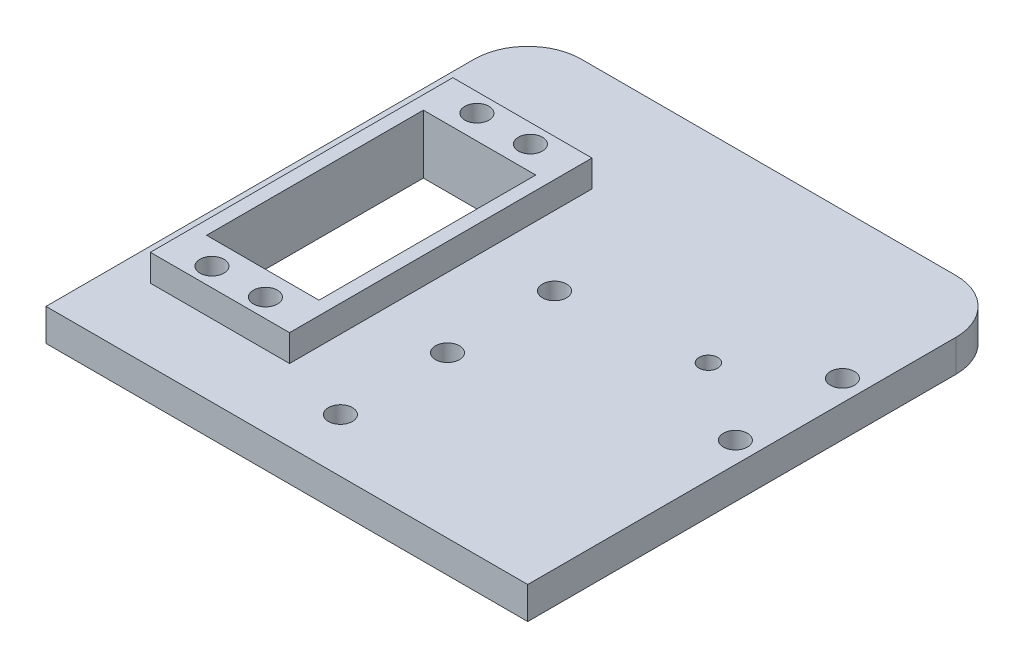
ISO-10303-21;
HEADER;
FILE_DESCRIPTION(('STEP AP214'),'2;1');
FILE_NAME('part.step','',(''),(''),'','','');
FILE_SCHEMA(('AUTOMOTIVE_DESIGN { 1 0 10303 214 1 1 1 1 }'));
ENDSEC;
DATA;
#1=APPLICATION_CONTEXT('core data for automotive mechanical design processes');
#2=APPLICATION_PROTOCOL_DEFINITION('international standard','automotive_design',2000,#1);
#3=PRODUCT_CONTEXT('',#1,'mechanical');
#4=PRODUCT('Part','Part','',(#3));
#5=PRODUCT_RELATED_PRODUCT_CATEGORY('part','',(#4));
#6=PRODUCT_DEFINITION_FORMATION('','',#4);
#7=PRODUCT_DEFINITION_CONTEXT('part definition',#1,'design');
#8=PRODUCT_DEFINITION('design','',#6,#7);
#9=PRODUCT_DEFINITION_SHAPE('','',#8);
#10=(LENGTH_UNIT() NAMED_UNIT(*) SI_UNIT(.MILLI.,.METRE.));
#11=(NAMED_UNIT(*) PLANE_ANGLE_UNIT() SI_UNIT($,.RADIAN.));
#12=(NAMED_UNIT(*) SI_UNIT($,.STERADIAN.) SOLID_ANGLE_UNIT());
#13=UNCERTAINTY_MEASURE_WITH_UNIT(LENGTH_MEASURE(1.E-05),#10,'distance_accuracy_value','');
#14=(GEOMETRIC_REPRESENTATION_CONTEXT(3) GLOBAL_UNCERTAINTY_ASSIGNED_CONTEXT((#13)) GLOBAL_UNIT_ASSIGNED_CONTEXT((#10,
#11,#12)) REPRESENTATION_CONTEXT('',''));
#15=CARTESIAN_POINT('',(0.,0.,0.));
#16=DIRECTION('',(0.,0.,1.));
#17=DIRECTION('',(1.,0.,0.));
#18=AXIS2_PLACEMENT_3D('',#15,#16,#17);
#19=CARTESIAN_POINT('',(0.,0.,0.));
#20=DIRECTION('',(0.,1.,0.));
#21=DIRECTION('',(0.,0.,1.));
#22=AXIS2_PLACEMENT_3D('',#19,#20,#21);
#23=PLANE('',#22);
#24=CARTESIAN_POINT('',(26.,0.,-2.75));
#25=DIRECTION('',(0.,1.,0.));
#26=DIRECTION('',(0.,0.,1.));
#27=AXIS2_PLACEMENT_3D('',#24,#25,#26);
#28=CIRCLE('',#27,1.75);
#29=CARTESIAN_POINT('',(26.,0.,-0.999999999999999));
#30=VERTEX_POINT('',#29);
#31=EDGE_CURVE('E279',#30,#30,#28,.T.);
#32=ORIENTED_EDGE('',*,*,#31,.T.);
#33=EDGE_LOOP('',(#32));
#34=FACE_BOUND('',#33,.T.);
#35=CARTESIAN_POINT('',(26.,0.,-2.75));
#36=DIRECTION('',(0.,-1.,0.));
#37=DIRECTION('',(0.,0.,-1.));
#38=AXIS2_PLACEMENT_3D('',#35,#36,#37);
#39=CIRCLE('',#38,7.5);
#40=CARTESIAN_POINT('',(26.,0.,-10.25));
#41=VERTEX_POINT('',#40);
#42=EDGE_CURVE('E320',#41,#41,#39,.T.);
#43=ORIENTED_EDGE('',*,*,#42,.T.);
#44=EDGE_LOOP('',(#43));
#45=FACE_BOUND('',#44,.T.);
#46=ADVANCED_FACE('F44',(#34,#45),#23,.F.);
#47=CARTESIAN_POINT('',(0.,6.,0.));
#48=DIRECTION('',(0.,1.,0.));
#49=DIRECTION('',(0.,0.,1.));
#50=AXIS2_PLACEMENT_3D('',#47,#48,#49);
#51=PLANE('',#50);
#52=CARTESIAN_POINT('',(0.,6.,0.));
#53=DIRECTION('',(0.,1.,0.));
#54=DIRECTION('',(0.,0.,1.));
#55=AXIS2_PLACEMENT_3D('',#52,#53,#54);
#56=CIRCLE('',#55,2.25);
#57=CARTESIAN_POINT('',(0.,6.,2.25));
#58=VERTEX_POINT('',#57);
#59=EDGE_CURVE('E313',#58,#58,#56,.T.);
#60=ORIENTED_EDGE('',*,*,#59,.F.);
#61=EDGE_LOOP('',(#60));
#62=FACE_BOUND('',#61,.T.);
#63=CARTESIAN_POINT('',(0.,6.,20.));
#64=DIRECTION('',(0.,1.,0.));
#65=DIRECTION('',(0.,0.,1.));
#66=AXIS2_PLACEMENT_3D('',#63,#64,#65);
#67=CIRCLE('',#66,2.25);
#68=CARTESIAN_POINT('',(0.,6.,22.25));
#69=VERTEX_POINT('',#68);
#70=EDGE_CURVE('E773',#69,#69,#67,.T.);
#71=ORIENTED_EDGE('',*,*,#70,.F.);
#72=EDGE_LOOP('',(#71));
#73=FACE_BOUND('',#72,.T.);
#74=CARTESIAN_POINT('',(0.,6.,40.));
#75=DIRECTION('',(0.,1.,0.));
#76=DIRECTION('',(0.,0.,1.));
#77=AXIS2_PLACEMENT_3D('',#74,#75,#76);
#78=CIRCLE('',#77,2.25);
#79=CARTESIAN_POINT('',(0.,6.,42.25));
#80=VERTEX_POINT('',#79);
#81=EDGE_CURVE('E777',#80,#80,#78,.T.);
#82=ORIENTED_EDGE('',*,*,#81,.F.);
#83=EDGE_LOOP('',(#82));
#84=FACE_BOUND('',#83,.T.);
#85=CARTESIAN_POINT('',(-41.6973967527109,6.,-12.75));
#86=DIRECTION('',(0.,1.,0.));
#87=DIRECTION('',(0.,0.,1.));
#88=AXIS2_PLACEMENT_3D('',#85,#86,#87);
#89=CIRCLE('',#88,2.25);
#90=CARTESIAN_POINT('',(-41.6973967527109,6.,-10.5));
#91=VERTEX_POINT('',#90);
#92=EDGE_CURVE('E366',#91,#91,#89,.T.);
#93=ORIENTED_EDGE('',*,*,#92,.F.);
#94=EDGE_LOOP('',(#93));
#95=FACE_BOUND('',#94,.T.);
#96=CARTESIAN_POINT('',(41.0420349176978,6.,7.25));
#97=DIRECTION('',(0.,1.,0.));
#98=DIRECTION('',(0.,0.,1.));
#99=AXIS2_PLACEMENT_3D('',#96,#97,#98);
#100=CIRCLE('',#99,2.25);
#101=CARTESIAN_POINT('',(41.0420349176978,6.,9.5));
#102=VERTEX_POINT('',#101);
#103=EDGE_CURVE('E362',#102,#102,#100,.T.);
#104=ORIENTED_EDGE('',*,*,#103,.F.);
#105=EDGE_LOOP('',(#104));
#106=FACE_BOUND('',#105,.T.);
#107=CARTESIAN_POINT('',(-41.6973967527109,6.,7.25));
#108=DIRECTION('',(0.,1.,0.));
#109=DIRECTION('',(0.,0.,1.));
#110=AXIS2_PLACEMENT_3D('',#107,#108,#109);
#111=CIRCLE('',#110,2.25);
#112=CARTESIAN_POINT('',(-41.6973967527109,6.,9.5));
#113=VERTEX_POINT('',#112);
#114=EDGE_CURVE('E358',#113,#113,#111,.T.);
#115=ORIENTED_EDGE('',*,*,#114,.F.);
#116=EDGE_LOOP('',(#115));
#117=FACE_BOUND('',#116,.T.);
#118=CARTESIAN_POINT('',(41.0420349176978,6.,-12.75));
#119=DIRECTION('',(0.,1.,0.));
#120=DIRECTION('',(0.,0.,1.));
#121=AXIS2_PLACEMENT_3D('',#118,#119,#120);
#122=CIRCLE('',#121,2.25);
#123=CARTESIAN_POINT('',(41.0420349176978,6.,-10.5));
#124=VERTEX_POINT('',#123);
#125=EDGE_CURVE('E354',#124,#124,#122,.T.);
#126=ORIENTED_EDGE('',*,*,#125,.F.);
#127=EDGE_LOOP('',(#126));
#128=FACE_BOUND('',#127,.T.);
#129=CARTESIAN_POINT('',(26.,6.,-2.75));
#130=DIRECTION('',(0.,1.,0.));
#131=DIRECTION('',(0.,0.,1.));
#132=AXIS2_PLACEMENT_3D('',#129,#130,#131);
#133=CIRCLE('',#132,1.75);
#134=CARTESIAN_POINT('',(26.,6.,-0.999999999999999));
#135=VERTEX_POINT('',#134);
#136=EDGE_CURVE('E284',#135,#135,#133,.T.);
#137=ORIENTED_EDGE('',*,*,#136,.F.);
#138=EDGE_LOOP('',(#137));
#139=FACE_BOUND('',#138,.T.);
#140=DIRECTION('',(0.,0.,-1.));
#141=VECTOR('',#140,1.);
#142=CARTESIAN_POINT('',(45.,6.,-40.));
#143=LINE('',#142,#141);
#144=CARTESIAN_POINT('',(45.,6.,50.));
#145=VERTEX_POINT('',#144);
#146=CARTESIAN_POINT('',(45.,6.,-30.));
#147=VERTEX_POINT('',#146);
#148=EDGE_CURVE('E254',#145,#147,#143,.T.);
#149=ORIENTED_EDGE('',*,*,#148,.T.);
#150=CARTESIAN_POINT('',(35.,6.,-30.));
#151=DIRECTION('',(0.,1.,0.));
#152=DIRECTION('',(0.,0.,1.));
#153=AXIS2_PLACEMENT_3D('',#150,#151,#152);
#154=CIRCLE('',#153,10.);
#155=CARTESIAN_POINT('',(35.,6.,-40.));
#156=VERTEX_POINT('',#155);
#157=EDGE_CURVE('E54',#147,#156,#154,.T.);
#158=ORIENTED_EDGE('',*,*,#157,.T.);
#159=DIRECTION('',(-1.,0.,0.));
#160=VECTOR('',#159,1.);
#161=CARTESIAN_POINT('',(-45.,6.,-40.));
#162=LINE('',#161,#160);
#163=CARTESIAN_POINT('',(-35.,6.,-40.));
#164=VERTEX_POINT('',#163);
#165=EDGE_CURVE('E257',#156,#164,#162,.T.);
#166=ORIENTED_EDGE('',*,*,#165,.T.);
#167=CARTESIAN_POINT('',(-35.,6.,-30.));
#168=DIRECTION('',(0.,1.,0.));
#169=DIRECTION('',(0.,0.,1.));
#170=AXIS2_PLACEMENT_3D('',#167,#168,#169);
#171=CIRCLE('',#170,10.);
#172=CARTESIAN_POINT('',(-45.,6.,-30.));
#173=VERTEX_POINT('',#172);
#174=EDGE_CURVE('E296',#164,#173,#171,.T.);
#175=ORIENTED_EDGE('',*,*,#174,.T.);
#176=DIRECTION('',(0.,0.,1.));
#177=VECTOR('',#176,1.);
#178=CARTESIAN_POINT('',(-45.,6.,-40.));
#179=LINE('',#178,#177);
#180=CARTESIAN_POINT('',(-45.,6.,50.));
#181=VERTEX_POINT('',#180);
#182=EDGE_CURVE('E247',#173,#181,#179,.T.);
#183=ORIENTED_EDGE('',*,*,#182,.T.);
#184=DIRECTION('',(1.,0.,0.));
#185=VECTOR('',#184,1.);
#186=CARTESIAN_POINT('',(-45.,6.,50.));
#187=LINE('',#186,#185);
#188=EDGE_CURVE('E250',#181,#145,#187,.T.);
#189=ORIENTED_EDGE('',*,*,#188,.T.);
#190=EDGE_LOOP('',(#149,#158,#166,#175,#183,#189));
#191=FACE_BOUND('',#190,.T.);
#192=DIRECTION('',(1.,0.,0.));
#193=VECTOR('',#192,1.);
#194=CARTESIAN_POINT('',(-39.,6.,36.5));
#195=LINE('',#194,#193);
#196=CARTESIAN_POINT('',(-39.,6.,36.5));
#197=VERTEX_POINT('',#196);
#198=CARTESIAN_POINT('',(-13.,6.,36.5));
#199=VERTEX_POINT('',#198);
#200=EDGE_CURVE('E224',#197,#199,#195,.T.);
#201=ORIENTED_EDGE('',*,*,#200,.F.);
#202=DIRECTION('',(0.,0.,1.));
#203=VECTOR('',#202,1.);
#204=CARTESIAN_POINT('',(-39.,6.,-20.));
#205=LINE('',#204,#203);
#206=CARTESIAN_POINT('',(-39.,6.,-20.));
#207=VERTEX_POINT('',#206);
#208=EDGE_CURVE('E205',#207,#197,#205,.T.);
#209=ORIENTED_EDGE('',*,*,#208,.F.);
#210=DIRECTION('',(-1.,0.,0.));
#211=VECTOR('',#210,1.);
#212=CARTESIAN_POINT('',(-39.,6.,-20.));
#213=LINE('',#212,#211);
#214=CARTESIAN_POINT('',(-13.,6.,-20.));
#215=VERTEX_POINT('',#214);
#216=EDGE_CURVE('E211',#215,#207,#213,.T.);
#217=ORIENTED_EDGE('',*,*,#216,.F.);
#218=DIRECTION('',(0.,0.,-1.));
#219=VECTOR('',#218,1.);
#220=CARTESIAN_POINT('',(-13.,6.,-20.));
#221=LINE('',#220,#219);
#222=EDGE_CURVE('E227',#199,#215,#221,.T.);
#223=ORIENTED_EDGE('',*,*,#222,.F.);
#224=EDGE_LOOP('',(#201,#209,#217,#223));
#225=FACE_BOUND('',#224,.T.);
#226=ADVANCED_FACE('F424',(#62,#73,#84,#95,#106,#117,#128,#139,#191,#225),#51,.T.);
#227=CARTESIAN_POINT('',(-45.,6.,-40.));
#228=DIRECTION('',(1.,0.,0.));
#229=DIRECTION('',(0.,0.,-1.));
#230=AXIS2_PLACEMENT_3D('',#227,#228,#229);
#231=PLANE('',#230);
#232=ORIENTED_EDGE('',*,*,#182,.F.);
#233=DIRECTION('',(0.,-1.,0.));
#234=VECTOR('',#233,1.);
#235=CARTESIAN_POINT('',(-45.,6.,-30.));
#236=LINE('',#235,#234);
#237=CARTESIAN_POINT('',(-45.,0.,-30.));
#238=VERTEX_POINT('',#237);
#239=EDGE_CURVE('E278',#173,#238,#236,.T.);
#240=ORIENTED_EDGE('',*,*,#239,.T.);
#241=DIRECTION('',(0.,0.,1.));
#242=VECTOR('',#241,1.);
#243=CARTESIAN_POINT('',(-45.,0.,-40.));
#244=LINE('',#243,#242);
#245=CARTESIAN_POINT('',(-45.,0.,50.));
#246=VERTEX_POINT('',#245);
#247=EDGE_CURVE('E246',#238,#246,#244,.T.);
#248=ORIENTED_EDGE('',*,*,#247,.T.);
#249=DIRECTION('',(0.,-1.,0.));
#250=VECTOR('',#249,1.);
#251=CARTESIAN_POINT('',(-45.,6.,50.));
#252=LINE('',#251,#250);
#253=EDGE_CURVE('E274',#181,#246,#252,.T.);
#254=ORIENTED_EDGE('',*,*,#253,.F.);
#255=EDGE_LOOP('',(#232,#240,#248,#254));
#256=FACE_BOUND('',#255,.T.);
#257=ADVANCED_FACE('F435',(#256),#231,.F.);
#258=CARTESIAN_POINT('',(-45.,6.,50.));
#259=DIRECTION('',(0.,0.,-1.));
#260=DIRECTION('',(-1.,0.,0.));
#261=AXIS2_PLACEMENT_3D('',#258,#259,#260);
#262=PLANE('',#261);
#263=DIRECTION('',(1.,0.,0.));
#264=VECTOR('',#263,1.);
#265=CARTESIAN_POINT('',(-45.,0.,50.));
#266=LINE('',#265,#264);
#267=CARTESIAN_POINT('',(45.,0.,50.));
#268=VERTEX_POINT('',#267);
#269=EDGE_CURVE('E263',#246,#268,#266,.T.);
#270=ORIENTED_EDGE('',*,*,#269,.T.);
#271=DIRECTION('',(0.,-1.,0.));
#272=VECTOR('',#271,1.);
#273=CARTESIAN_POINT('',(45.,6.,50.));
#274=LINE('',#273,#272);
#275=EDGE_CURVE('E260',#145,#268,#274,.T.);
#276=ORIENTED_EDGE('',*,*,#275,.F.);
#277=ORIENTED_EDGE('',*,*,#188,.F.);
#278=ORIENTED_EDGE('',*,*,#253,.T.);
#279=EDGE_LOOP('',(#270,#276,#277,#278));
#280=FACE_BOUND('',#279,.T.);
#281=ADVANCED_FACE('F432',(#280),#262,.F.);
#282=CARTESIAN_POINT('',(45.,6.,-40.));
#283=DIRECTION('',(-1.,0.,0.));
#284=DIRECTION('',(0.,0.,1.));
#285=AXIS2_PLACEMENT_3D('',#282,#283,#284);
#286=PLANE('',#285);
#287=DIRECTION('',(0.,0.,-1.));
#288=VECTOR('',#287,1.);
#289=CARTESIAN_POINT('',(45.,0.,-40.));
#290=LINE('',#289,#288);
#291=CARTESIAN_POINT('',(45.,0.,-30.));
#292=VERTEX_POINT('',#291);
#293=EDGE_CURVE('E266',#268,#292,#290,.T.);
#294=ORIENTED_EDGE('',*,*,#293,.T.);
#295=DIRECTION('',(0.,-1.,0.));
#296=VECTOR('',#295,1.);
#297=CARTESIAN_POINT('',(45.,6.,-30.));
#298=LINE('',#297,#296);
#299=EDGE_CURVE('E62',#292,#147,#298,.F.);
#300=ORIENTED_EDGE('',*,*,#299,.T.);
#301=ORIENTED_EDGE('',*,*,#148,.F.);
#302=ORIENTED_EDGE('',*,*,#275,.T.);
#303=EDGE_LOOP('',(#294,#300,#301,#302));
#304=FACE_BOUND('',#303,.T.);
#305=ADVANCED_FACE('F428',(#304),#286,.F.);
#306=CARTESIAN_POINT('',(-45.,6.,-40.));
#307=DIRECTION('',(0.,0.,1.));
#308=DIRECTION('',(1.,0.,0.));
#309=AXIS2_PLACEMENT_3D('',#306,#307,#308);
#310=PLANE('',#309);
#311=ORIENTED_EDGE('',*,*,#165,.F.);
#312=DIRECTION('',(0.,-1.,0.));
#313=VECTOR('',#312,1.);
#314=CARTESIAN_POINT('',(35.,6.,-40.));
#315=LINE('',#314,#313);
#316=CARTESIAN_POINT('',(35.,0.,-40.));
#317=VERTEX_POINT('',#316);
#318=EDGE_CURVE('E299',#156,#317,#315,.T.);
#319=ORIENTED_EDGE('',*,*,#318,.T.);
#320=DIRECTION('',(-1.,0.,0.));
#321=VECTOR('',#320,1.);
#322=CARTESIAN_POINT('',(-45.,0.,-40.));
#323=LINE('',#322,#321);
#324=CARTESIAN_POINT('',(-35.,0.,-40.));
#325=VERTEX_POINT('',#324);
#326=EDGE_CURVE('E251',#317,#325,#323,.T.);
#327=ORIENTED_EDGE('',*,*,#326,.T.);
#328=DIRECTION('',(0.,-1.,0.));
#329=VECTOR('',#328,1.);
#330=CARTESIAN_POINT('',(-35.,6.,-40.));
#331=LINE('',#330,#329);
#332=EDGE_CURVE('E292',#325,#164,#331,.F.);
#333=ORIENTED_EDGE('',*,*,#332,.T.);
#334=EDGE_LOOP('',(#311,#319,#327,#333));
#335=FACE_BOUND('',#334,.T.);
#336=ADVANCED_FACE('F413',(#335),#310,.F.);
#337=CARTESIAN_POINT('',(0.,0.,0.));
#338=DIRECTION('',(0.,1.,0.));
#339=DIRECTION('',(0.,0.,1.));
#340=AXIS2_PLACEMENT_3D('',#337,#338,#339);
#341=CIRCLE('',#340,2.25);
#342=CARTESIAN_POINT('',(0.,0.,2.25));
#343=VERTEX_POINT('',#342);
#344=EDGE_CURVE('E48',#343,#343,#341,.T.);
#345=ORIENTED_EDGE('',*,*,#344,.T.);
#346=EDGE_LOOP('',(#345));
#347=FACE_BOUND('',#346,.T.);
#348=CARTESIAN_POINT('',(0.,0.,20.));
#349=DIRECTION('',(0.,1.,0.));
#350=DIRECTION('',(0.,0.,1.));
#351=AXIS2_PLACEMENT_3D('',#348,#349,#350);
#352=CIRCLE('',#351,2.25);
#353=CARTESIAN_POINT('',(0.,0.,22.25));
#354=VERTEX_POINT('',#353);
#355=EDGE_CURVE('E312',#354,#354,#352,.T.);
#356=ORIENTED_EDGE('',*,*,#355,.T.);
#357=EDGE_LOOP('',(#356));
#358=FACE_BOUND('',#357,.T.);
#359=CARTESIAN_POINT('',(0.,0.,40.));
#360=DIRECTION('',(0.,1.,0.));
#361=DIRECTION('',(0.,0.,1.));
#362=AXIS2_PLACEMENT_3D('',#359,#360,#361);
#363=CIRCLE('',#362,2.25);
#364=CARTESIAN_POINT('',(0.,0.,42.25));
#365=VERTEX_POINT('',#364);
#366=EDGE_CURVE('E309',#365,#365,#363,.T.);
#367=ORIENTED_EDGE('',*,*,#366,.T.);
#368=EDGE_LOOP('',(#367));
#369=FACE_BOUND('',#368,.T.);
#370=CARTESIAN_POINT('',(26.,0.,-2.75));
#371=DIRECTION('',(0.,1.,0.));
#372=DIRECTION('',(0.,0.,1.));
#373=AXIS2_PLACEMENT_3D('',#370,#371,#372);
#374=CIRCLE('',#373,9.5);
#375=CARTESIAN_POINT('',(26.,0.,6.75));
#376=VERTEX_POINT('',#375);
#377=EDGE_CURVE('E11',#376,#376,#374,.F.);
#378=ORIENTED_EDGE('',*,*,#377,.F.);
#379=EDGE_LOOP('',(#378));
#380=FACE_BOUND('',#379,.T.);
#381=CARTESIAN_POINT('',(-41.6973967527109,0.,-12.75));
#382=DIRECTION('',(0.,-1.,0.));
#383=DIRECTION('',(0.,0.,-1.));
#384=AXIS2_PLACEMENT_3D('',#381,#382,#383);
#385=CIRCLE('',#384,2.25);
#386=CARTESIAN_POINT('',(-41.6973967527109,0.,-15.));
#387=VERTEX_POINT('',#386);
#388=EDGE_CURVE('E343',#387,#387,#385,.T.);
#389=ORIENTED_EDGE('',*,*,#388,.F.);
#390=EDGE_LOOP('',(#389));
#391=FACE_BOUND('',#390,.T.);
#392=CARTESIAN_POINT('',(41.0420349176978,0.,7.25));
#393=DIRECTION('',(0.,-1.,0.));
#394=DIRECTION('',(0.,0.,-1.));
#395=AXIS2_PLACEMENT_3D('',#392,#393,#394);
#396=CIRCLE('',#395,2.25);
#397=CARTESIAN_POINT('',(41.0420349176978,0.,5.));
#398=VERTEX_POINT('',#397);
#399=EDGE_CURVE('E342',#398,#398,#396,.T.);
#400=ORIENTED_EDGE('',*,*,#399,.F.);
#401=EDGE_LOOP('',(#400));
#402=FACE_BOUND('',#401,.T.);
#403=CARTESIAN_POINT('',(-41.6973967527109,0.,7.25));
#404=DIRECTION('',(0.,-1.,0.));
#405=DIRECTION('',(0.,0.,-1.));
#406=AXIS2_PLACEMENT_3D('',#403,#404,#405);
#407=CIRCLE('',#406,2.25);
#408=CARTESIAN_POINT('',(-41.6973967527109,0.,5.));
#409=VERTEX_POINT('',#408);
#410=EDGE_CURVE('E338',#409,#409,#407,.T.);
#411=ORIENTED_EDGE('',*,*,#410,.F.);
#412=EDGE_LOOP('',(#411));
#413=FACE_BOUND('',#412,.T.);
#414=CARTESIAN_POINT('',(41.0420349176978,0.,-12.75));
#415=DIRECTION('',(0.,-1.,0.));
#416=DIRECTION('',(0.,0.,-1.));
#417=AXIS2_PLACEMENT_3D('',#414,#415,#416);
#418=CIRCLE('',#417,2.25);
#419=CARTESIAN_POINT('',(41.0420349176978,0.,-15.));
#420=VERTEX_POINT('',#419);
#421=EDGE_CURVE('E347',#420,#420,#418,.T.);
#422=ORIENTED_EDGE('',*,*,#421,.F.);
#423=EDGE_LOOP('',(#422));
#424=FACE_BOUND('',#423,.T.);
#425=DIRECTION('',(-1.,0.,0.));
#426=VECTOR('',#425,1.);
#427=CARTESIAN_POINT('',(0.,0.,-12.));
#428=LINE('',#427,#426);
#429=CARTESIAN_POINT('',(-15.5,0.,-12.));
#430=VERTEX_POINT('',#429);
#431=CARTESIAN_POINT('',(-36.5,0.,-12.));
#432=VERTEX_POINT('',#431);
#433=EDGE_CURVE('E197',#430,#432,#428,.T.);
#434=ORIENTED_EDGE('',*,*,#433,.T.);
#435=DIRECTION('',(0.,0.,1.));
#436=VECTOR('',#435,1.);
#437=CARTESIAN_POINT('',(-36.5,0.,0.));
#438=LINE('',#437,#436);
#439=CARTESIAN_POINT('',(-36.5,0.,28.5));
#440=VERTEX_POINT('',#439);
#441=EDGE_CURVE('E201',#432,#440,#438,.T.);
#442=ORIENTED_EDGE('',*,*,#441,.T.);
#443=DIRECTION('',(1.,0.,0.));
#444=VECTOR('',#443,1.);
#445=CARTESIAN_POINT('',(0.,0.,28.5));
#446=LINE('',#445,#444);
#447=CARTESIAN_POINT('',(-15.5,0.,28.5));
#448=VERTEX_POINT('',#447);
#449=EDGE_CURVE('E188',#440,#448,#446,.T.);
#450=ORIENTED_EDGE('',*,*,#449,.T.);
#451=DIRECTION('',(0.,0.,-1.));
#452=VECTOR('',#451,1.);
#453=CARTESIAN_POINT('',(-15.5,0.,0.));
#454=LINE('',#453,#452);
#455=EDGE_CURVE('E158',#448,#430,#454,.T.);
#456=ORIENTED_EDGE('',*,*,#455,.T.);
#457=EDGE_LOOP('',(#434,#442,#450,#456));
#458=FACE_BOUND('',#457,.T.);
#459=ORIENTED_EDGE('',*,*,#326,.F.);
#460=CARTESIAN_POINT('',(35.,0.,-30.));
#461=DIRECTION('',(0.,1.,0.));
#462=DIRECTION('',(0.,0.,1.));
#463=AXIS2_PLACEMENT_3D('',#460,#461,#462);
#464=CIRCLE('',#463,10.);
#465=EDGE_CURVE('E70',#317,#292,#464,.F.);
#466=ORIENTED_EDGE('',*,*,#465,.T.);
#467=ORIENTED_EDGE('',*,*,#293,.F.);
#468=ORIENTED_EDGE('',*,*,#269,.F.);
#469=ORIENTED_EDGE('',*,*,#247,.F.);
#470=CARTESIAN_POINT('',(-35.,0.,-30.));
#471=DIRECTION('',(0.,1.,0.));
#472=DIRECTION('',(0.,0.,1.));
#473=AXIS2_PLACEMENT_3D('',#470,#471,#472);
#474=CIRCLE('',#473,10.);
#475=EDGE_CURVE('E288',#238,#325,#474,.F.);
#476=ORIENTED_EDGE('',*,*,#475,.T.);
#477=EDGE_LOOP('',(#459,#466,#467,#468,#469,#476));
#478=FACE_BOUND('',#477,.T.);
#479=ADVANCED_FACE('F410',(#347,#358,#369,#380,#391,#402,#413,#424,#458,#478),#23,.F.);
#480=CARTESIAN_POINT('',(-39.,11.,-20.));
#481=DIRECTION('',(1.,0.,0.));
#482=DIRECTION('',(0.,0.,-1.));
#483=AXIS2_PLACEMENT_3D('',#480,#481,#482);
#484=PLANE('',#483);
#485=ORIENTED_EDGE('',*,*,#208,.T.);
#486=DIRECTION('',(0.,-1.,0.));
#487=VECTOR('',#486,1.);
#488=CARTESIAN_POINT('',(-39.,11.,36.5));
#489=LINE('',#488,#487);
#490=CARTESIAN_POINT('',(-39.,11.,36.5));
#491=VERTEX_POINT('',#490);
#492=EDGE_CURVE('E243',#491,#197,#489,.T.);
#493=ORIENTED_EDGE('',*,*,#492,.F.);
#494=DIRECTION('',(0.,0.,1.));
#495=VECTOR('',#494,1.);
#496=CARTESIAN_POINT('',(-39.,11.,-20.));
#497=LINE('',#496,#495);
#498=CARTESIAN_POINT('',(-39.,11.,-20.));
#499=VERTEX_POINT('',#498);
#500=EDGE_CURVE('E206',#499,#491,#497,.T.);
#501=ORIENTED_EDGE('',*,*,#500,.F.);
#502=DIRECTION('',(0.,-1.,0.));
#503=VECTOR('',#502,1.);
#504=CARTESIAN_POINT('',(-39.,11.,-20.));
#505=LINE('',#504,#503);
#506=EDGE_CURVE('E220',#499,#207,#505,.T.);
#507=ORIENTED_EDGE('',*,*,#506,.T.);
#508=EDGE_LOOP('',(#485,#493,#501,#507));
#509=FACE_BOUND('',#508,.T.);
#510=ADVANCED_FACE('F412',(#509),#484,.F.);
#511=CARTESIAN_POINT('',(-39.,11.,36.5));
#512=DIRECTION('',(0.,0.,-1.));
#513=DIRECTION('',(-1.,0.,0.));
#514=AXIS2_PLACEMENT_3D('',#511,#512,#513);
#515=PLANE('',#514);
#516=ORIENTED_EDGE('',*,*,#200,.T.);
#517=DIRECTION('',(0.,-1.,0.));
#518=VECTOR('',#517,1.);
#519=CARTESIAN_POINT('',(-13.,11.,36.5));
#520=LINE('',#519,#518);
#521=CARTESIAN_POINT('',(-13.,11.,36.5));
#522=VERTEX_POINT('',#521);
#523=EDGE_CURVE('E239',#522,#199,#520,.T.);
#524=ORIENTED_EDGE('',*,*,#523,.F.);
#525=DIRECTION('',(1.,0.,0.));
#526=VECTOR('',#525,1.);
#527=CARTESIAN_POINT('',(-39.,11.,36.5));
#528=LINE('',#527,#526);
#529=EDGE_CURVE('E210',#491,#522,#528,.T.);
#530=ORIENTED_EDGE('',*,*,#529,.F.);
#531=ORIENTED_EDGE('',*,*,#492,.T.);
#532=EDGE_LOOP('',(#516,#524,#530,#531));
#533=FACE_BOUND('',#532,.T.);
#534=ADVANCED_FACE('F599',(#533),#515,.F.);
#535=CARTESIAN_POINT('',(-13.,11.,-20.));
#536=DIRECTION('',(-1.,0.,0.));
#537=DIRECTION('',(0.,0.,1.));
#538=AXIS2_PLACEMENT_3D('',#535,#536,#537);
#539=PLANE('',#538);
#540=ORIENTED_EDGE('',*,*,#222,.T.);
#541=DIRECTION('',(0.,-1.,0.));
#542=VECTOR('',#541,1.);
#543=CARTESIAN_POINT('',(-13.,11.,-20.));
#544=LINE('',#543,#542);
#545=CARTESIAN_POINT('',(-13.,11.,-20.));
#546=VERTEX_POINT('',#545);
#547=EDGE_CURVE('E236',#546,#215,#544,.T.);
#548=ORIENTED_EDGE('',*,*,#547,.F.);
#549=DIRECTION('',(0.,0.,-1.));
#550=VECTOR('',#549,1.);
#551=CARTESIAN_POINT('',(-13.,11.,-20.));
#552=LINE('',#551,#550);
#553=EDGE_CURVE('E214',#522,#546,#552,.T.);
#554=ORIENTED_EDGE('',*,*,#553,.F.);
#555=ORIENTED_EDGE('',*,*,#523,.T.);
#556=EDGE_LOOP('',(#540,#548,#554,#555));
#557=FACE_BOUND('',#556,.T.);
#558=ADVANCED_FACE('F590',(#557),#539,.F.);
#559=CARTESIAN_POINT('',(-39.,11.,-20.));
#560=DIRECTION('',(0.,0.,1.));
#561=DIRECTION('',(1.,0.,0.));
#562=AXIS2_PLACEMENT_3D('',#559,#560,#561);
#563=PLANE('',#562);
#564=ORIENTED_EDGE('',*,*,#216,.T.);
#565=ORIENTED_EDGE('',*,*,#506,.F.);
#566=DIRECTION('',(-1.,0.,0.));
#567=VECTOR('',#566,1.);
#568=CARTESIAN_POINT('',(-39.,11.,-20.));
#569=LINE('',#568,#567);
#570=EDGE_CURVE('E217',#546,#499,#569,.T.);
#571=ORIENTED_EDGE('',*,*,#570,.F.);
#572=ORIENTED_EDGE('',*,*,#547,.T.);
#573=EDGE_LOOP('',(#564,#565,#571,#572));
#574=FACE_BOUND('',#573,.T.);
#575=ADVANCED_FACE('F554',(#574),#563,.F.);
#576=CARTESIAN_POINT('',(0.,11.,0.));
#577=DIRECTION('',(0.,1.,0.));
#578=DIRECTION('',(0.,0.,1.));
#579=AXIS2_PLACEMENT_3D('',#576,#577,#578);
#580=PLANE('',#579);
#581=CARTESIAN_POINT('',(-21.,11.,-16.5));
#582=DIRECTION('',(0.,1.,0.));
#583=DIRECTION('',(0.,0.,1.));
#584=AXIS2_PLACEMENT_3D('',#581,#582,#583);
#585=CIRCLE('',#584,2.25000000000001);
#586=CARTESIAN_POINT('',(-21.,11.,-14.25));
#587=VERTEX_POINT('',#586);
#588=EDGE_CURVE('E381',#587,#587,#585,.T.);
#589=ORIENTED_EDGE('',*,*,#588,.F.);
#590=EDGE_LOOP('',(#589));
#591=FACE_BOUND('',#590,.T.);
#592=CARTESIAN_POINT('',(-31.,11.,33.));
#593=DIRECTION('',(0.,1.,0.));
#594=DIRECTION('',(0.,0.,1.));
#595=AXIS2_PLACEMENT_3D('',#592,#593,#594);
#596=CIRCLE('',#595,2.25);
#597=CARTESIAN_POINT('',(-31.,11.,35.25));
#598=VERTEX_POINT('',#597);
#599=EDGE_CURVE('E390',#598,#598,#596,.T.);
#600=ORIENTED_EDGE('',*,*,#599,.F.);
#601=EDGE_LOOP('',(#600));
#602=FACE_BOUND('',#601,.T.);
#603=CARTESIAN_POINT('',(-21.,11.,33.));
#604=DIRECTION('',(0.,1.,0.));
#605=DIRECTION('',(0.,0.,1.));
#606=AXIS2_PLACEMENT_3D('',#603,#604,#605);
#607=CIRCLE('',#606,2.25);
#608=CARTESIAN_POINT('',(-21.,11.,35.25));
#609=VERTEX_POINT('',#608);
#610=EDGE_CURVE('E373',#609,#609,#607,.T.);
#611=ORIENTED_EDGE('',*,*,#610,.F.);
#612=EDGE_LOOP('',(#611));
#613=FACE_BOUND('',#612,.T.);
#614=CARTESIAN_POINT('',(-31.,11.,-16.5));
#615=DIRECTION('',(0.,1.,0.));
#616=DIRECTION('',(0.,0.,1.));
#617=AXIS2_PLACEMENT_3D('',#614,#615,#616);
#618=CIRCLE('',#617,2.25);
#619=CARTESIAN_POINT('',(-31.,11.,-14.25));
#620=VERTEX_POINT('',#619);
#621=EDGE_CURVE('E385',#620,#620,#618,.T.);
#622=ORIENTED_EDGE('',*,*,#621,.F.);
#623=EDGE_LOOP('',(#622));
#624=FACE_BOUND('',#623,.T.);
#625=DIRECTION('',(0.,0.,1.));
#626=VECTOR('',#625,1.);
#627=CARTESIAN_POINT('',(-36.5,11.,-12.));
#628=LINE('',#627,#626);
#629=CARTESIAN_POINT('',(-36.5,11.,-12.));
#630=VERTEX_POINT('',#629);
#631=CARTESIAN_POINT('',(-36.5,11.,28.5));
#632=VERTEX_POINT('',#631);
#633=EDGE_CURVE('E173',#630,#632,#628,.T.);
#634=ORIENTED_EDGE('',*,*,#633,.F.);
#635=DIRECTION('',(-1.,0.,0.));
#636=VECTOR('',#635,1.);
#637=CARTESIAN_POINT('',(-36.5,11.,-12.));
#638=LINE('',#637,#636);
#639=CARTESIAN_POINT('',(-15.5,11.,-12.));
#640=VERTEX_POINT('',#639);
#641=EDGE_CURVE('E178',#640,#630,#638,.T.);
#642=ORIENTED_EDGE('',*,*,#641,.F.);
#643=DIRECTION('',(0.,0.,-1.));
#644=VECTOR('',#643,1.);
#645=CARTESIAN_POINT('',(-15.5,11.,-12.));
#646=LINE('',#645,#644);
#647=CARTESIAN_POINT('',(-15.5,11.,28.5));
#648=VERTEX_POINT('',#647);
#649=EDGE_CURVE('E155',#648,#640,#646,.T.);
#650=ORIENTED_EDGE('',*,*,#649,.F.);
#651=DIRECTION('',(1.,0.,0.));
#652=VECTOR('',#651,1.);
#653=CARTESIAN_POINT('',(-36.5,11.,28.5));
#654=LINE('',#653,#652);
#655=EDGE_CURVE('E167',#632,#648,#654,.T.);
#656=ORIENTED_EDGE('',*,*,#655,.F.);
#657=EDGE_LOOP('',(#634,#642,#650,#656));
#658=FACE_BOUND('',#657,.T.);
#659=ORIENTED_EDGE('',*,*,#500,.T.);
#660=ORIENTED_EDGE('',*,*,#529,.T.);
#661=ORIENTED_EDGE('',*,*,#553,.T.);
#662=ORIENTED_EDGE('',*,*,#570,.T.);
#663=EDGE_LOOP('',(#659,#660,#661,#662));
#664=FACE_BOUND('',#663,.T.);
#665=ADVANCED_FACE('F175',(#591,#602,#613,#624,#658,#664),#580,.T.);
#666=CARTESIAN_POINT('',(-36.5,-1.,-12.));
#667=DIRECTION('',(-1.,0.,0.));
#668=DIRECTION('',(0.,0.,1.));
#669=AXIS2_PLACEMENT_3D('',#666,#667,#668);
#670=PLANE('',#669);
#671=DIRECTION('',(0.,1.,0.));
#672=VECTOR('',#671,1.);
#673=CARTESIAN_POINT('',(-36.5,-1.,-12.));
#674=LINE('',#673,#672);
#675=EDGE_CURVE('E185',#432,#630,#674,.T.);
#676=ORIENTED_EDGE('',*,*,#675,.T.);
#677=ORIENTED_EDGE('',*,*,#633,.T.);
#678=DIRECTION('',(0.,1.,0.));
#679=VECTOR('',#678,1.);
#680=CARTESIAN_POINT('',(-36.5,-1.,28.5));
#681=LINE('',#680,#679);
#682=EDGE_CURVE('E163',#440,#632,#681,.T.);
#683=ORIENTED_EDGE('',*,*,#682,.F.);
#684=ORIENTED_EDGE('',*,*,#441,.F.);
#685=EDGE_LOOP('',(#676,#677,#683,#684));
#686=FACE_BOUND('',#685,.T.);
#687=ADVANCED_FACE('F405',(#686),#670,.F.);
#688=CARTESIAN_POINT('',(-36.5,-1.,-12.));
#689=DIRECTION('',(0.,0.,-1.));
#690=DIRECTION('',(-1.,0.,0.));
#691=AXIS2_PLACEMENT_3D('',#688,#689,#690);
#692=PLANE('',#691);
#693=DIRECTION('',(0.,1.,0.));
#694=VECTOR('',#693,1.);
#695=CARTESIAN_POINT('',(-15.5,-1.,-12.));
#696=LINE('',#695,#694);
#697=EDGE_CURVE('E162',#430,#640,#696,.T.);
#698=ORIENTED_EDGE('',*,*,#697,.T.);
#699=ORIENTED_EDGE('',*,*,#641,.T.);
#700=ORIENTED_EDGE('',*,*,#675,.F.);
#701=ORIENTED_EDGE('',*,*,#433,.F.);
#702=EDGE_LOOP('',(#698,#699,#700,#701));
#703=FACE_BOUND('',#702,.T.);
#704=ADVANCED_FACE('F408',(#703),#692,.F.);
#705=CARTESIAN_POINT('',(-15.5,-1.,-12.));
#706=DIRECTION('',(1.,0.,0.));
#707=DIRECTION('',(0.,0.,-1.));
#708=AXIS2_PLACEMENT_3D('',#705,#706,#707);
#709=PLANE('',#708);
#710=DIRECTION('',(0.,1.,0.));
#711=VECTOR('',#710,1.);
#712=CARTESIAN_POINT('',(-15.5,-1.,28.5));
#713=LINE('',#712,#711);
#714=EDGE_CURVE('E150',#448,#648,#713,.T.);
#715=ORIENTED_EDGE('',*,*,#714,.T.);
#716=ORIENTED_EDGE('',*,*,#649,.T.);
#717=ORIENTED_EDGE('',*,*,#697,.F.);
#718=ORIENTED_EDGE('',*,*,#455,.F.);
#719=EDGE_LOOP('',(#715,#716,#717,#718));
#720=FACE_BOUND('',#719,.T.);
#721=ADVANCED_FACE('F152',(#720),#709,.F.);
#722=CARTESIAN_POINT('',(-36.5,-1.,28.5));
#723=DIRECTION('',(0.,0.,1.));
#724=DIRECTION('',(1.,0.,0.));
#725=AXIS2_PLACEMENT_3D('',#722,#723,#724);
#726=PLANE('',#725);
#727=ORIENTED_EDGE('',*,*,#682,.T.);
#728=ORIENTED_EDGE('',*,*,#655,.T.);
#729=ORIENTED_EDGE('',*,*,#714,.F.);
#730=ORIENTED_EDGE('',*,*,#449,.F.);
#731=EDGE_LOOP('',(#727,#728,#729,#730));
#732=FACE_BOUND('',#731,.T.);
#733=ADVANCED_FACE('F168',(#732),#726,.F.);
#734=CARTESIAN_POINT('',(-31.,0.999999999999999,-16.5));
#735=DIRECTION('',(0.,1.,0.));
#736=DIRECTION('',(0.,0.,1.));
#737=AXIS2_PLACEMENT_3D('',#734,#735,#736);
#738=CYLINDRICAL_SURFACE('',#737,2.25);
#739=CARTESIAN_POINT('',(-31.,0.999999999999999,-16.5));
#740=DIRECTION('',(0.,1.,0.));
#741=DIRECTION('',(0.,0.,1.));
#742=AXIS2_PLACEMENT_3D('',#739,#740,#741);
#743=CIRCLE('',#742,2.25);
#744=CARTESIAN_POINT('',(-31.,0.999999999999999,-14.25));
#745=VERTEX_POINT('',#744);
#746=EDGE_CURVE('E397',#745,#745,#743,.T.);
#747=ORIENTED_EDGE('',*,*,#746,.F.);
#748=EDGE_LOOP('',(#747));
#749=FACE_BOUND('',#748,.T.);
#750=ORIENTED_EDGE('',*,*,#621,.T.);
#751=EDGE_LOOP('',(#750));
#752=FACE_BOUND('',#751,.T.);
#753=ADVANCED_FACE('F536',(#749,#752),#738,.F.);
#754=CARTESIAN_POINT('',(-31.,0.999999999999999,-16.5));
#755=DIRECTION('',(0.,1.,0.));
#756=DIRECTION('',(0.,0.,1.));
#757=AXIS2_PLACEMENT_3D('',#754,#755,#756);
#758=PLANE('',#757);
#759=ORIENTED_EDGE('',*,*,#746,.T.);
#760=EDGE_LOOP('',(#759));
#761=FACE_BOUND('',#760,.T.);
#762=ADVANCED_FACE('F527',(#761),#758,.T.);
#763=CARTESIAN_POINT('',(-21.,0.999999999999999,33.));
#764=DIRECTION('',(0.,1.,0.));
#765=DIRECTION('',(0.,0.,1.));
#766=AXIS2_PLACEMENT_3D('',#763,#764,#765);
#767=CYLINDRICAL_SURFACE('',#766,2.25);
#768=CARTESIAN_POINT('',(-21.,0.999999999999999,33.));
#769=DIRECTION('',(0.,1.,0.));
#770=DIRECTION('',(0.,0.,1.));
#771=AXIS2_PLACEMENT_3D('',#768,#769,#770);
#772=CIRCLE('',#771,2.25);
#773=CARTESIAN_POINT('',(-21.,0.999999999999999,35.25));
#774=VERTEX_POINT('',#773);
#775=EDGE_CURVE('E283',#774,#774,#772,.T.);
#776=ORIENTED_EDGE('',*,*,#775,.F.);
#777=EDGE_LOOP('',(#776));
#778=FACE_BOUND('',#777,.T.);
#779=ORIENTED_EDGE('',*,*,#610,.T.);
#780=EDGE_LOOP('',(#779));
#781=FACE_BOUND('',#780,.T.);
#782=ADVANCED_FACE('F518',(#778,#781),#767,.F.);
#783=CARTESIAN_POINT('',(-21.,0.999999999999999,33.));
#784=DIRECTION('',(0.,1.,0.));
#785=DIRECTION('',(0.,0.,1.));
#786=AXIS2_PLACEMENT_3D('',#783,#784,#785);
#787=PLANE('',#786);
#788=ORIENTED_EDGE('',*,*,#775,.T.);
#789=EDGE_LOOP('',(#788));
#790=FACE_BOUND('',#789,.T.);
#791=ADVANCED_FACE('F509',(#790),#787,.T.);
#792=CARTESIAN_POINT('',(-31.,0.999999999999999,33.));
#793=DIRECTION('',(0.,1.,0.));
#794=DIRECTION('',(0.,0.,1.));
#795=AXIS2_PLACEMENT_3D('',#792,#793,#794);
#796=CYLINDRICAL_SURFACE('',#795,2.25);
#797=CARTESIAN_POINT('',(-31.,0.999999999999999,33.));
#798=DIRECTION('',(0.,1.,0.));
#799=DIRECTION('',(0.,0.,1.));
#800=AXIS2_PLACEMENT_3D('',#797,#798,#799);
#801=CIRCLE('',#800,2.25);
#802=CARTESIAN_POINT('',(-31.,0.999999999999999,35.25));
#803=VERTEX_POINT('',#802);
#804=EDGE_CURVE('E377',#803,#803,#801,.T.);
#805=ORIENTED_EDGE('',*,*,#804,.F.);
#806=EDGE_LOOP('',(#805));
#807=FACE_BOUND('',#806,.T.);
#808=ORIENTED_EDGE('',*,*,#599,.T.);
#809=EDGE_LOOP('',(#808));
#810=FACE_BOUND('',#809,.T.);
#811=ADVANCED_FACE('F500',(#807,#810),#796,.F.);
#812=CARTESIAN_POINT('',(-31.,0.999999999999999,33.));
#813=DIRECTION('',(0.,1.,0.));
#814=DIRECTION('',(0.,0.,1.));
#815=AXIS2_PLACEMENT_3D('',#812,#813,#814);
#816=PLANE('',#815);
#817=ORIENTED_EDGE('',*,*,#804,.T.);
#818=EDGE_LOOP('',(#817));
#819=FACE_BOUND('',#818,.T.);
#820=ADVANCED_FACE('F491',(#819),#816,.T.);
#821=CARTESIAN_POINT('',(-21.,0.999999999999999,-16.5));
#822=DIRECTION('',(0.,1.,0.));
#823=DIRECTION('',(0.,0.,1.));
#824=AXIS2_PLACEMENT_3D('',#821,#822,#823);
#825=CYLINDRICAL_SURFACE('',#824,2.25000000000001);
#826=CARTESIAN_POINT('',(-21.,0.999999999999999,-16.5));
#827=DIRECTION('',(0.,1.,0.));
#828=DIRECTION('',(0.,0.,1.));
#829=AXIS2_PLACEMENT_3D('',#826,#827,#828);
#830=CIRCLE('',#829,2.25000000000001);
#831=CARTESIAN_POINT('',(-21.,0.999999999999999,-14.25));
#832=VERTEX_POINT('',#831);
#833=EDGE_CURVE('E386',#832,#832,#830,.T.);
#834=ORIENTED_EDGE('',*,*,#833,.F.);
#835=EDGE_LOOP('',(#834));
#836=FACE_BOUND('',#835,.T.);
#837=ORIENTED_EDGE('',*,*,#588,.T.);
#838=EDGE_LOOP('',(#837));
#839=FACE_BOUND('',#838,.T.);
#840=ADVANCED_FACE('F482',(#836,#839),#825,.F.);
#841=CARTESIAN_POINT('',(-21.,0.999999999999999,-16.5));
#842=DIRECTION('',(0.,1.,0.));
#843=DIRECTION('',(0.,0.,1.));
#844=AXIS2_PLACEMENT_3D('',#841,#842,#843);
#845=PLANE('',#844);
#846=ORIENTED_EDGE('',*,*,#833,.T.);
#847=EDGE_LOOP('',(#846));
#848=FACE_BOUND('',#847,.T.);
#849=ADVANCED_FACE('F448',(#848),#845,.T.);
#850=CARTESIAN_POINT('',(26.,-5.,-2.75));
#851=DIRECTION('',(0.,1.,0.));
#852=DIRECTION('',(0.,0.,1.));
#853=AXIS2_PLACEMENT_3D('',#850,#851,#852);
#854=CYLINDRICAL_SURFACE('',#853,1.75);
#855=ORIENTED_EDGE('',*,*,#136,.T.);
#856=EDGE_LOOP('',(#855));
#857=FACE_BOUND('',#856,.T.);
#858=ORIENTED_EDGE('',*,*,#31,.F.);
#859=EDGE_LOOP('',(#858));
#860=FACE_BOUND('',#859,.T.);
#861=ADVANCED_FACE('F440',(#857,#860),#854,.F.);
#862=CARTESIAN_POINT('',(-35.,6.,-30.));
#863=DIRECTION('',(0.,-1.,0.));
#864=DIRECTION('',(0.,0.,-1.));
#865=AXIS2_PLACEMENT_3D('',#862,#863,#864);
#866=CYLINDRICAL_SURFACE('',#865,10.);
#867=ORIENTED_EDGE('',*,*,#174,.F.);
#868=ORIENTED_EDGE('',*,*,#332,.F.);
#869=ORIENTED_EDGE('',*,*,#475,.F.);
#870=ORIENTED_EDGE('',*,*,#239,.F.);
#871=EDGE_LOOP('',(#867,#868,#869,#870));
#872=FACE_BOUND('',#871,.T.);
#873=ADVANCED_FACE('F438',(#872),#866,.T.);
#874=CARTESIAN_POINT('',(35.,6.,-30.));
#875=DIRECTION('',(0.,-1.,0.));
#876=DIRECTION('',(0.,0.,-1.));
#877=AXIS2_PLACEMENT_3D('',#874,#875,#876);
#878=CYLINDRICAL_SURFACE('',#877,10.);
#879=ORIENTED_EDGE('',*,*,#157,.F.);
#880=ORIENTED_EDGE('',*,*,#299,.F.);
#881=ORIENTED_EDGE('',*,*,#465,.F.);
#882=ORIENTED_EDGE('',*,*,#318,.F.);
#883=EDGE_LOOP('',(#879,#880,#881,#882));
#884=FACE_BOUND('',#883,.T.);
#885=ADVANCED_FACE('F46',(#884),#878,.T.);
#886=CARTESIAN_POINT('',(41.0420349176978,11.,-12.75));
#887=DIRECTION('',(0.,-1.,0.));
#888=DIRECTION('',(0.,0.,-1.));
#889=AXIS2_PLACEMENT_3D('',#886,#887,#888);
#890=CYLINDRICAL_SURFACE('',#889,2.25);
#891=ORIENTED_EDGE('',*,*,#125,.T.);
#892=EDGE_LOOP('',(#891));
#893=FACE_BOUND('',#892,.T.);
#894=ORIENTED_EDGE('',*,*,#421,.T.);
#895=EDGE_LOOP('',(#894));
#896=FACE_BOUND('',#895,.T.);
#897=ADVANCED_FACE('F446',(#893,#896),#890,.F.);
#898=CARTESIAN_POINT('',(-41.6973967527109,11.,7.25));
#899=DIRECTION('',(0.,-1.,0.));
#900=DIRECTION('',(0.,0.,-1.));
#901=AXIS2_PLACEMENT_3D('',#898,#899,#900);
#902=CYLINDRICAL_SURFACE('',#901,2.25);
#903=ORIENTED_EDGE('',*,*,#114,.T.);
#904=EDGE_LOOP('',(#903));
#905=FACE_BOUND('',#904,.T.);
#906=ORIENTED_EDGE('',*,*,#410,.T.);
#907=EDGE_LOOP('',(#906));
#908=FACE_BOUND('',#907,.T.);
#909=ADVANCED_FACE('F682',(#905,#908),#902,.F.);
#910=CARTESIAN_POINT('',(41.0420349176978,11.,7.25));
#911=DIRECTION('',(0.,-1.,0.));
#912=DIRECTION('',(0.,0.,-1.));
#913=AXIS2_PLACEMENT_3D('',#910,#911,#912);
#914=CYLINDRICAL_SURFACE('',#913,2.25);
#915=ORIENTED_EDGE('',*,*,#103,.T.);
#916=EDGE_LOOP('',(#915));
#917=FACE_BOUND('',#916,.T.);
#918=ORIENTED_EDGE('',*,*,#399,.T.);
#919=EDGE_LOOP('',(#918));
#920=FACE_BOUND('',#919,.T.);
#921=ADVANCED_FACE('F691',(#917,#920),#914,.F.);
#922=CARTESIAN_POINT('',(-41.6973967527109,11.,-12.75));
#923=DIRECTION('',(0.,-1.,0.));
#924=DIRECTION('',(0.,0.,-1.));
#925=AXIS2_PLACEMENT_3D('',#922,#923,#924);
#926=CYLINDRICAL_SURFACE('',#925,2.25);
#927=ORIENTED_EDGE('',*,*,#92,.T.);
#928=EDGE_LOOP('',(#927));
#929=FACE_BOUND('',#928,.T.);
#930=ORIENTED_EDGE('',*,*,#388,.T.);
#931=EDGE_LOOP('',(#930));
#932=FACE_BOUND('',#931,.T.);
#933=ADVANCED_FACE('F700',(#929,#932),#926,.F.);
#934=CARTESIAN_POINT('',(26.,-2.,-2.75));
#935=DIRECTION('',(0.,-1.,0.));
#936=DIRECTION('',(0.,0.,-1.));
#937=AXIS2_PLACEMENT_3D('',#934,#935,#936);
#938=PLANE('',#937);
#939=CARTESIAN_POINT('',(26.,-2.,-2.75));
#940=DIRECTION('',(0.,-1.,0.));
#941=DIRECTION('',(0.,0.,-1.));
#942=AXIS2_PLACEMENT_3D('',#939,#940,#941);
#943=CIRCLE('',#942,9.5);
#944=CARTESIAN_POINT('',(26.,-2.,-12.25));
#945=VERTEX_POINT('',#944);
#946=EDGE_CURVE('E331',#945,#945,#943,.T.);
#947=ORIENTED_EDGE('',*,*,#946,.T.);
#948=EDGE_LOOP('',(#947));
#949=FACE_BOUND('',#948,.T.);
#950=CARTESIAN_POINT('',(26.,-2.,-2.75));
#951=DIRECTION('',(0.,-1.,0.));
#952=DIRECTION('',(0.,0.,-1.));
#953=AXIS2_PLACEMENT_3D('',#950,#951,#952);
#954=CIRCLE('',#953,7.5);
#955=CARTESIAN_POINT('',(26.,-2.,-10.25));
#956=VERTEX_POINT('',#955);
#957=EDGE_CURVE('E325',#956,#956,#954,.T.);
#958=ORIENTED_EDGE('',*,*,#957,.F.);
#959=EDGE_LOOP('',(#958));
#960=FACE_BOUND('',#959,.T.);
#961=ADVANCED_FACE('F707',(#949,#960),#938,.T.);
#962=CARTESIAN_POINT('',(26.,-2.,-2.75));
#963=DIRECTION('',(0.,1.,0.));
#964=DIRECTION('',(0.,0.,1.));
#965=AXIS2_PLACEMENT_3D('',#962,#963,#964);
#966=CYLINDRICAL_SURFACE('',#965,9.5);
#967=ORIENTED_EDGE('',*,*,#946,.F.);
#968=EDGE_LOOP('',(#967));
#969=FACE_BOUND('',#968,.T.);
#970=ORIENTED_EDGE('',*,*,#377,.T.);
#971=EDGE_LOOP('',(#970));
#972=FACE_BOUND('',#971,.T.);
#973=ADVANCED_FACE('F720',(#969,#972),#966,.T.);
#974=CARTESIAN_POINT('',(26.,-2.,-2.75));
#975=DIRECTION('',(0.,1.,0.));
#976=DIRECTION('',(0.,0.,1.));
#977=AXIS2_PLACEMENT_3D('',#974,#975,#976);
#978=CYLINDRICAL_SURFACE('',#977,7.5);
#979=ORIENTED_EDGE('',*,*,#957,.T.);
#980=EDGE_LOOP('',(#979));
#981=FACE_BOUND('',#980,.T.);
#982=ORIENTED_EDGE('',*,*,#42,.F.);
#983=EDGE_LOOP('',(#982));
#984=FACE_BOUND('',#983,.T.);
#985=ADVANCED_FACE('F729',(#981,#984),#978,.F.);
#986=CARTESIAN_POINT('',(0.,-4.,40.));
#987=DIRECTION('',(0.,1.,0.));
#988=DIRECTION('',(0.,0.,1.));
#989=AXIS2_PLACEMENT_3D('',#986,#987,#988);
#990=CYLINDRICAL_SURFACE('',#989,2.25);
#991=ORIENTED_EDGE('',*,*,#81,.T.);
#992=EDGE_LOOP('',(#991));
#993=FACE_BOUND('',#992,.T.);
#994=ORIENTED_EDGE('',*,*,#366,.F.);
#995=EDGE_LOOP('',(#994));
#996=FACE_BOUND('',#995,.T.);
#997=ADVANCED_FACE('F737',(#993,#996),#990,.F.);
#998=CARTESIAN_POINT('',(0.,-4.,20.));
#999=DIRECTION('',(0.,1.,0.));
#1000=DIRECTION('',(0.,0.,1.));
#1001=AXIS2_PLACEMENT_3D('',#998,#999,#1000);
#1002=CYLINDRICAL_SURFACE('',#1001,2.25);
#1003=ORIENTED_EDGE('',*,*,#70,.T.);
#1004=EDGE_LOOP('',(#1003));
#1005=FACE_BOUND('',#1004,.T.);
#1006=ORIENTED_EDGE('',*,*,#355,.F.);
#1007=EDGE_LOOP('',(#1006));
#1008=FACE_BOUND('',#1007,.T.);
#1009=ADVANCED_FACE('F745',(#1005,#1008),#1002,.F.);
#1010=CARTESIAN_POINT('',(0.,-4.,0.));
#1011=DIRECTION('',(0.,1.,0.));
#1012=DIRECTION('',(0.,0.,1.));
#1013=AXIS2_PLACEMENT_3D('',#1010,#1011,#1012);
#1014=CYLINDRICAL_SURFACE('',#1013,2.25);
#1015=ORIENTED_EDGE('',*,*,#59,.T.);
#1016=EDGE_LOOP('',(#1015));
#1017=FACE_BOUND('',#1016,.T.);
#1018=ORIENTED_EDGE('',*,*,#344,.F.);
#1019=EDGE_LOOP('',(#1018));
#1020=FACE_BOUND('',#1019,.T.);
#1021=ADVANCED_FACE('F754',(#1017,#1020),#1014,.F.);
#1022=CLOSED_SHELL('',(#46,#226,#257,#281,#305,#336,#479,#510,#534,#558,#575,#665,#687,#704,
#721,#733,#753,#762,#782,#791,#811,#820,#840,#849,#861,#873,#885,#897,#909,#921,#933,#961,#973,
#985,#997,#1009,#1021));
#1023=MANIFOLD_SOLID_BREP('B2',#1022);
#1024=ADVANCED_BREP_SHAPE_REPRESENTATION('',(#18,#1023),#14);
#1025=SHAPE_DEFINITION_REPRESENTATION(#9,#1024);
ENDSEC;
END-ISO-10303-21;
